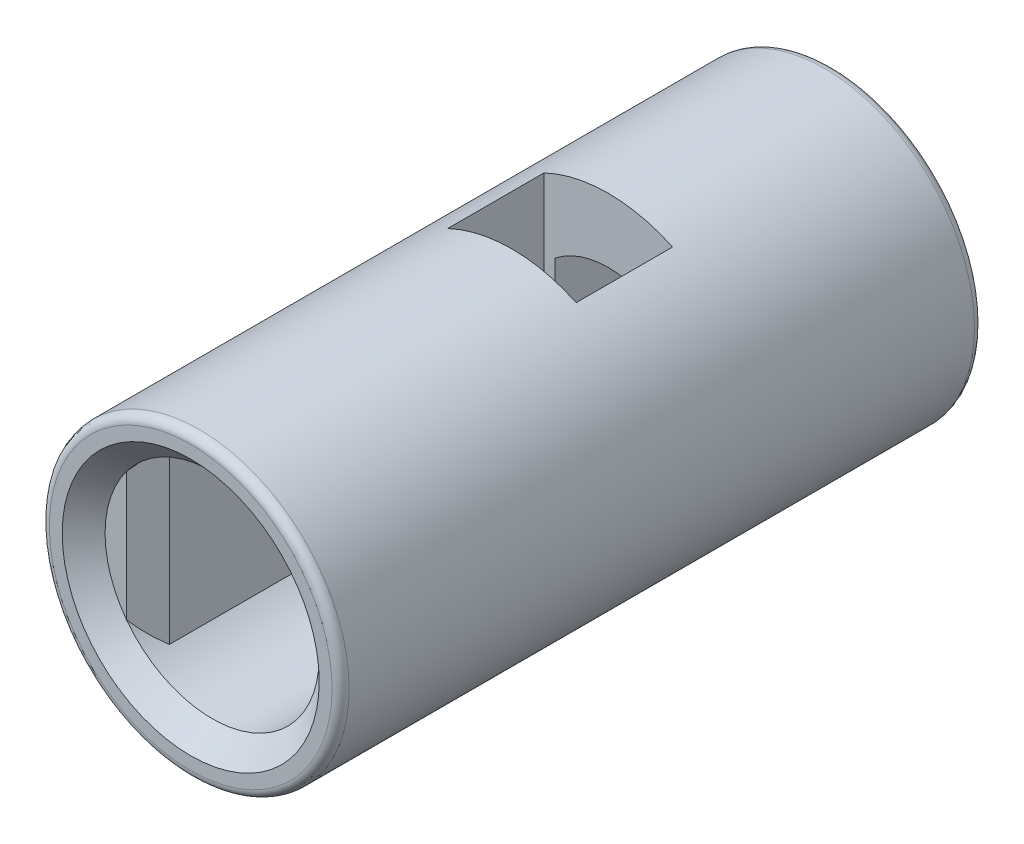
ISO-10303-21;
HEADER;
FILE_DESCRIPTION(('STEP AP214'),'2;1');
FILE_NAME('part.step','',(''),(''),'','','');
FILE_SCHEMA(('AUTOMOTIVE_DESIGN { 1 0 10303 214 1 1 1 1 }'));
ENDSEC;
DATA;
#1=APPLICATION_CONTEXT('core data for automotive mechanical design processes');
#2=APPLICATION_PROTOCOL_DEFINITION('international standard','automotive_design',2000,#1);
#3=PRODUCT_CONTEXT('',#1,'mechanical');
#4=PRODUCT('Part','Part','',(#3));
#5=PRODUCT_RELATED_PRODUCT_CATEGORY('part','',(#4));
#6=PRODUCT_DEFINITION_FORMATION('','',#4);
#7=PRODUCT_DEFINITION_CONTEXT('part definition',#1,'design');
#8=PRODUCT_DEFINITION('design','',#6,#7);
#9=PRODUCT_DEFINITION_SHAPE('','',#8);
#10=(LENGTH_UNIT() NAMED_UNIT(*) SI_UNIT(.MILLI.,.METRE.));
#11=(NAMED_UNIT(*) PLANE_ANGLE_UNIT() SI_UNIT($,.RADIAN.));
#12=(NAMED_UNIT(*) SI_UNIT($,.STERADIAN.) SOLID_ANGLE_UNIT());
#13=UNCERTAINTY_MEASURE_WITH_UNIT(LENGTH_MEASURE(1.E-05),#10,'distance_accuracy_value','');
#14=(GEOMETRIC_REPRESENTATION_CONTEXT(3) GLOBAL_UNCERTAINTY_ASSIGNED_CONTEXT((#13)) GLOBAL_UNIT_ASSIGNED_CONTEXT((#10,
#11,#12)) REPRESENTATION_CONTEXT('',''));
#15=CARTESIAN_POINT('',(0.,0.,0.));
#16=DIRECTION('',(0.,0.,1.));
#17=DIRECTION('',(1.,0.,0.));
#18=AXIS2_PLACEMENT_3D('',#15,#16,#17);
#19=CARTESIAN_POINT('',(0.,3.501,0.));
#20=DIRECTION('',(0.,0.,-1.));
#21=DIRECTION('',(-1.,0.,0.));
#22=AXIS2_PLACEMENT_3D('',#19,#20,#21);
#23=PLANE('',#22);
#24=CARTESIAN_POINT('',(0.,0.,0.));
#25=DIRECTION('',(0.,0.,1.));
#26=DIRECTION('',(1.,0.,0.));
#27=AXIS2_PLACEMENT_3D('',#24,#25,#26);
#28=CIRCLE('',#27,2.5);
#29=CARTESIAN_POINT('',(1.5,2.,0.));
#30=VERTEX_POINT('',#29);
#31=CARTESIAN_POINT('',(-1.5,2.,0.));
#32=VERTEX_POINT('',#31);
#33=EDGE_CURVE('E163',#30,#32,#28,.T.);
#34=ORIENTED_EDGE('',*,*,#33,.T.);
#35=DIRECTION('',(0.,-1.,0.));
#36=VECTOR('',#35,1.);
#37=CARTESIAN_POINT('',(-1.5,3.501,0.));
#38=LINE('',#37,#36);
#39=CARTESIAN_POINT('',(-1.5,3.16227766016838,0.));
#40=VERTEX_POINT('',#39);
#41=EDGE_CURVE('E168',#40,#32,#38,.T.);
#42=ORIENTED_EDGE('',*,*,#41,.F.);
#43=CARTESIAN_POINT('',(0.,0.,0.));
#44=DIRECTION('',(0.,0.,-1.));
#45=DIRECTION('',(-1.,0.,0.));
#46=AXIS2_PLACEMENT_3D('',#43,#44,#45);
#47=CIRCLE('',#46,3.5);
#48=CARTESIAN_POINT('',(1.5,3.16227766016838,0.));
#49=VERTEX_POINT('',#48);
#50=EDGE_CURVE('E284',#49,#40,#47,.F.);
#51=ORIENTED_EDGE('',*,*,#50,.F.);
#52=DIRECTION('',(0.,-1.,0.));
#53=VECTOR('',#52,1.);
#54=CARTESIAN_POINT('',(1.5,3.501,0.));
#55=LINE('',#54,#53);
#56=EDGE_CURVE('E169',#49,#30,#55,.T.);
#57=ORIENTED_EDGE('',*,*,#56,.T.);
#58=EDGE_LOOP('',(#34,#42,#51,#57));
#59=FACE_BOUND('',#58,.T.);
#60=ADVANCED_FACE('F34',(#59),#23,.T.);
#61=CARTESIAN_POINT('',(0.,0.,7.5));
#62=DIRECTION('',(0.,0.,-1.));
#63=DIRECTION('',(-1.,0.,0.));
#64=AXIS2_PLACEMENT_3D('',#61,#62,#63);
#65=CYLINDRICAL_SURFACE('',#64,3.5);
#66=CARTESIAN_POINT('',(0.,0.,-7.3));
#67=DIRECTION('',(0.,0.,1.));
#68=DIRECTION('',(1.,0.,0.));
#69=AXIS2_PLACEMENT_3D('',#66,#67,#68);
#70=CIRCLE('',#69,3.5);
#71=CARTESIAN_POINT('',(3.5,0.,-7.3));
#72=VERTEX_POINT('',#71);
#73=EDGE_CURVE('E195',#72,#72,#70,.T.);
#74=ORIENTED_EDGE('',*,*,#73,.T.);
#75=EDGE_LOOP('',(#74));
#76=FACE_BOUND('',#75,.T.);
#77=CARTESIAN_POINT('',(0.,0.,7.3));
#78=DIRECTION('',(0.,0.,1.));
#79=DIRECTION('',(1.,0.,0.));
#80=AXIS2_PLACEMENT_3D('',#77,#78,#79);
#81=CIRCLE('',#80,3.5);
#82=CARTESIAN_POINT('',(3.5,0.,7.3));
#83=VERTEX_POINT('',#82);
#84=EDGE_CURVE('E192',#83,#83,#81,.F.);
#85=ORIENTED_EDGE('',*,*,#84,.T.);
#86=EDGE_LOOP('',(#85));
#87=FACE_BOUND('',#86,.T.);
#88=DIRECTION('',(0.,0.,-1.));
#89=VECTOR('',#88,1.);
#90=CARTESIAN_POINT('',(-1.5,-3.16227766016838,7.5));
#91=LINE('',#90,#89);
#92=CARTESIAN_POINT('',(-1.5,-3.16227766016838,0.));
#93=VERTEX_POINT('',#92);
#94=CARTESIAN_POINT('',(-1.5,-3.16227766016838,-2.25));
#95=VERTEX_POINT('',#94);
#96=EDGE_CURVE('E315',#93,#95,#91,.T.);
#97=ORIENTED_EDGE('',*,*,#96,.F.);
#98=CARTESIAN_POINT('',(0.,0.,0.));
#99=DIRECTION('',(0.,0.,1.));
#100=DIRECTION('',(1.,0.,0.));
#101=AXIS2_PLACEMENT_3D('',#98,#99,#100);
#102=CIRCLE('',#101,3.5);
#103=CARTESIAN_POINT('',(1.5,-3.16227766016838,0.));
#104=VERTEX_POINT('',#103);
#105=EDGE_CURVE('E166',#104,#93,#102,.F.);
#106=ORIENTED_EDGE('',*,*,#105,.F.);
#107=DIRECTION('',(0.,0.,-1.));
#108=VECTOR('',#107,1.);
#109=CARTESIAN_POINT('',(1.5,-3.16227766016838,7.5));
#110=LINE('',#109,#108);
#111=CARTESIAN_POINT('',(1.5,-3.16227766016838,-2.25));
#112=VERTEX_POINT('',#111);
#113=EDGE_CURVE('E319',#112,#104,#110,.F.);
#114=ORIENTED_EDGE('',*,*,#113,.F.);
#115=CARTESIAN_POINT('',(0.,0.,-2.25));
#116=DIRECTION('',(0.,0.,-1.));
#117=DIRECTION('',(-1.,0.,0.));
#118=AXIS2_PLACEMENT_3D('',#115,#116,#117);
#119=CIRCLE('',#118,3.5);
#120=EDGE_CURVE('E317',#95,#112,#119,.F.);
#121=ORIENTED_EDGE('',*,*,#120,.F.);
#122=EDGE_LOOP('',(#97,#106,#114,#121));
#123=FACE_BOUND('',#122,.T.);
#124=DIRECTION('',(0.,0.,-1.));
#125=VECTOR('',#124,1.);
#126=CARTESIAN_POINT('',(-1.5,3.16227766016838,7.5));
#127=LINE('',#126,#125);
#128=CARTESIAN_POINT('',(-1.5,3.16227766016838,-2.25));
#129=VERTEX_POINT('',#128);
#130=EDGE_CURVE('E291',#40,#129,#127,.T.);
#131=ORIENTED_EDGE('',*,*,#130,.T.);
#132=CARTESIAN_POINT('',(0.,0.,-2.25));
#133=DIRECTION('',(0.,0.,1.));
#134=DIRECTION('',(1.,0.,0.));
#135=AXIS2_PLACEMENT_3D('',#132,#133,#134);
#136=CIRCLE('',#135,3.5);
#137=CARTESIAN_POINT('',(1.5,3.16227766016838,-2.25));
#138=VERTEX_POINT('',#137);
#139=EDGE_CURVE('E180',#129,#138,#136,.F.);
#140=ORIENTED_EDGE('',*,*,#139,.T.);
#141=DIRECTION('',(0.,0.,-1.));
#142=VECTOR('',#141,1.);
#143=CARTESIAN_POINT('',(1.5,3.16227766016838,7.5));
#144=LINE('',#143,#142);
#145=EDGE_CURVE('E280',#138,#49,#144,.F.);
#146=ORIENTED_EDGE('',*,*,#145,.T.);
#147=ORIENTED_EDGE('',*,*,#50,.T.);
#148=EDGE_LOOP('',(#131,#140,#146,#147));
#149=FACE_BOUND('',#148,.T.);
#150=ADVANCED_FACE('F310',(#76,#87,#123,#149),#65,.T.);
#151=CARTESIAN_POINT('',(0.,0.,7.5));
#152=DIRECTION('',(0.,0.,-1.));
#153=DIRECTION('',(-1.,0.,0.));
#154=AXIS2_PLACEMENT_3D('',#151,#152,#153);
#155=CYLINDRICAL_SURFACE('',#154,2.);
#156=DIRECTION('',(0.,0.,-1.));
#157=VECTOR('',#156,1.);
#158=CARTESIAN_POINT('',(1.25,-1.5612494995996,7.5));
#159=LINE('',#158,#157);
#160=CARTESIAN_POINT('',(1.25,-1.5612494995996,-2.25));
#161=VERTEX_POINT('',#160);
#162=CARTESIAN_POINT('',(1.25,-1.5612494995996,-7.));
#163=VERTEX_POINT('',#162);
#164=EDGE_CURVE('E190',#161,#163,#159,.T.);
#165=ORIENTED_EDGE('',*,*,#164,.T.);
#166=CARTESIAN_POINT('',(0.,0.,-7.));
#167=DIRECTION('',(0.,0.,1.));
#168=DIRECTION('',(1.,0.,0.));
#169=AXIS2_PLACEMENT_3D('',#166,#167,#168);
#170=CIRCLE('',#169,2.);
#171=CARTESIAN_POINT('',(-1.25,-1.5612494995996,-7.));
#172=VERTEX_POINT('',#171);
#173=EDGE_CURVE('E47',#163,#172,#170,.F.);
#174=ORIENTED_EDGE('',*,*,#173,.T.);
#175=DIRECTION('',(0.,0.,-1.));
#176=VECTOR('',#175,1.);
#177=CARTESIAN_POINT('',(-1.25,-1.5612494995996,7.5));
#178=LINE('',#177,#176);
#179=CARTESIAN_POINT('',(-1.25,-1.5612494995996,-2.25));
#180=VERTEX_POINT('',#179);
#181=EDGE_CURVE('E183',#180,#172,#178,.T.);
#182=ORIENTED_EDGE('',*,*,#181,.F.);
#183=CARTESIAN_POINT('',(0.,0.,-2.25));
#184=DIRECTION('',(0.,0.,-1.));
#185=DIRECTION('',(-1.,0.,0.));
#186=AXIS2_PLACEMENT_3D('',#183,#184,#185);
#187=CIRCLE('',#186,2.);
#188=EDGE_CURVE('E323',#180,#161,#187,.F.);
#189=ORIENTED_EDGE('',*,*,#188,.T.);
#190=EDGE_LOOP('',(#165,#174,#182,#189));
#191=FACE_BOUND('',#190,.T.);
#192=ADVANCED_FACE('F352',(#191),#155,.F.);
#193=CARTESIAN_POINT('',(1.25,1.5612494995996,7.5));
#194=DIRECTION('',(-1.,0.,0.));
#195=DIRECTION('',(0.,-1.,0.));
#196=AXIS2_PLACEMENT_3D('',#193,#194,#195);
#197=PLANE('',#196);
#198=DIRECTION('',(0.,0.,-1.));
#199=VECTOR('',#198,1.);
#200=CARTESIAN_POINT('',(1.25,1.5612494995996,7.5));
#201=LINE('',#200,#199);
#202=CARTESIAN_POINT('',(1.25,1.5612494995996,-2.25));
#203=VERTEX_POINT('',#202);
#204=CARTESIAN_POINT('',(1.25,1.5612494995996,-7.));
#205=VERTEX_POINT('',#204);
#206=EDGE_CURVE('E188',#203,#205,#201,.T.);
#207=ORIENTED_EDGE('',*,*,#206,.T.);
#208=DIRECTION('',(0.,-1.,0.));
#209=VECTOR('',#208,1.);
#210=CARTESIAN_POINT('',(1.25,-1.5612494995996,-7.));
#211=LINE('',#210,#209);
#212=EDGE_CURVE('E11',#205,#163,#211,.T.);
#213=ORIENTED_EDGE('',*,*,#212,.T.);
#214=ORIENTED_EDGE('',*,*,#164,.F.);
#215=DIRECTION('',(0.,-1.,0.));
#216=VECTOR('',#215,1.);
#217=CARTESIAN_POINT('',(1.25,3.501,-2.25));
#218=LINE('',#217,#216);
#219=EDGE_CURVE('E277',#203,#161,#218,.T.);
#220=ORIENTED_EDGE('',*,*,#219,.F.);
#221=EDGE_LOOP('',(#207,#213,#214,#220));
#222=FACE_BOUND('',#221,.T.);
#223=ADVANCED_FACE('F276',(#222),#197,.T.);
#224=CARTESIAN_POINT('',(0.,0.,7.5));
#225=DIRECTION('',(0.,0.,-1.));
#226=DIRECTION('',(-1.,0.,0.));
#227=AXIS2_PLACEMENT_3D('',#224,#225,#226);
#228=CYLINDRICAL_SURFACE('',#227,2.);
#229=DIRECTION('',(0.,0.,-1.));
#230=VECTOR('',#229,1.);
#231=CARTESIAN_POINT('',(-1.25,1.5612494995996,7.5));
#232=LINE('',#231,#230);
#233=CARTESIAN_POINT('',(-1.25,1.5612494995996,-2.25));
#234=VERTEX_POINT('',#233);
#235=CARTESIAN_POINT('',(-1.25,1.5612494995996,-7.));
#236=VERTEX_POINT('',#235);
#237=EDGE_CURVE('E185',#234,#236,#232,.T.);
#238=ORIENTED_EDGE('',*,*,#237,.T.);
#239=CARTESIAN_POINT('',(0.,0.,-7.));
#240=DIRECTION('',(0.,0.,1.));
#241=DIRECTION('',(1.,0.,0.));
#242=AXIS2_PLACEMENT_3D('',#239,#240,#241);
#243=CIRCLE('',#242,2.);
#244=EDGE_CURVE('E226',#236,#205,#243,.F.);
#245=ORIENTED_EDGE('',*,*,#244,.T.);
#246=ORIENTED_EDGE('',*,*,#206,.F.);
#247=CARTESIAN_POINT('',(0.,0.,-2.25));
#248=DIRECTION('',(0.,0.,1.));
#249=DIRECTION('',(1.,0.,0.));
#250=AXIS2_PLACEMENT_3D('',#247,#248,#249);
#251=CIRCLE('',#250,2.);
#252=EDGE_CURVE('E172',#234,#203,#251,.F.);
#253=ORIENTED_EDGE('',*,*,#252,.F.);
#254=EDGE_LOOP('',(#238,#245,#246,#253));
#255=FACE_BOUND('',#254,.T.);
#256=ADVANCED_FACE('F272',(#255),#228,.F.);
#257=CARTESIAN_POINT('',(-1.25,1.5612494995996,7.5));
#258=DIRECTION('',(1.,0.,0.));
#259=DIRECTION('',(0.,1.,0.));
#260=AXIS2_PLACEMENT_3D('',#257,#258,#259);
#261=PLANE('',#260);
#262=ORIENTED_EDGE('',*,*,#181,.T.);
#263=DIRECTION('',(0.,1.,0.));
#264=VECTOR('',#263,1.);
#265=CARTESIAN_POINT('',(-1.25,1.5612494995996,-7.));
#266=LINE('',#265,#264);
#267=EDGE_CURVE('E229',#172,#236,#266,.T.);
#268=ORIENTED_EDGE('',*,*,#267,.T.);
#269=ORIENTED_EDGE('',*,*,#237,.F.);
#270=DIRECTION('',(0.,1.,0.));
#271=VECTOR('',#270,1.);
#272=CARTESIAN_POINT('',(-1.25,3.501,-2.25));
#273=LINE('',#272,#271);
#274=EDGE_CURVE('E281',#180,#234,#273,.T.);
#275=ORIENTED_EDGE('',*,*,#274,.F.);
#276=EDGE_LOOP('',(#262,#268,#269,#275));
#277=FACE_BOUND('',#276,.T.);
#278=ADVANCED_FACE('F370',(#277),#261,.T.);
#279=CARTESIAN_POINT('',(0.,0.,7.5));
#280=DIRECTION('',(0.,0.,1.));
#281=DIRECTION('',(1.,0.,0.));
#282=AXIS2_PLACEMENT_3D('',#279,#280,#281);
#283=PLANE('',#282);
#284=CARTESIAN_POINT('',(0.,0.,7.5));
#285=DIRECTION('',(0.,0.,1.));
#286=DIRECTION('',(1.,0.,0.));
#287=AXIS2_PLACEMENT_3D('',#284,#285,#286);
#288=CIRCLE('',#287,3.00000000000001);
#289=CARTESIAN_POINT('',(3.00000000000001,0.,7.5));
#290=VERTEX_POINT('',#289);
#291=EDGE_CURVE('E204',#290,#290,#288,.F.);
#292=ORIENTED_EDGE('',*,*,#291,.T.);
#293=EDGE_LOOP('',(#292));
#294=FACE_BOUND('',#293,.T.);
#295=CARTESIAN_POINT('',(0.,0.,7.5));
#296=DIRECTION('',(0.,0.,1.));
#297=DIRECTION('',(1.,0.,0.));
#298=AXIS2_PLACEMENT_3D('',#295,#296,#297);
#299=CIRCLE('',#298,3.3);
#300=CARTESIAN_POINT('',(3.3,0.,7.5));
#301=VERTEX_POINT('',#300);
#302=EDGE_CURVE('E201',#301,#301,#299,.T.);
#303=ORIENTED_EDGE('',*,*,#302,.T.);
#304=EDGE_LOOP('',(#303));
#305=FACE_BOUND('',#304,.T.);
#306=ADVANCED_FACE('F366',(#294,#305),#283,.T.);
#307=CARTESIAN_POINT('',(0.,0.,-7.5));
#308=DIRECTION('',(0.,0.,1.));
#309=DIRECTION('',(1.,0.,0.));
#310=AXIS2_PLACEMENT_3D('',#307,#308,#309);
#311=PLANE('',#310);
#312=DIRECTION('',(0.,1.,0.));
#313=VECTOR('',#312,1.);
#314=CARTESIAN_POINT('',(1.75,1.5612494995996,-7.5));
#315=LINE('',#314,#313);
#316=CARTESIAN_POINT('',(1.75,-1.78535710713571,-7.5));
#317=VERTEX_POINT('',#316);
#318=CARTESIAN_POINT('',(1.75,1.78535710713571,-7.5));
#319=VERTEX_POINT('',#318);
#320=EDGE_CURVE('E217',#317,#319,#315,.T.);
#321=ORIENTED_EDGE('',*,*,#320,.T.);
#322=CARTESIAN_POINT('',(0.,0.,-7.5));
#323=DIRECTION('',(0.,0.,1.));
#324=DIRECTION('',(1.,0.,0.));
#325=AXIS2_PLACEMENT_3D('',#322,#323,#324);
#326=CIRCLE('',#325,2.5);
#327=CARTESIAN_POINT('',(-1.75,1.78535710713571,-7.5));
#328=VERTEX_POINT('',#327);
#329=EDGE_CURVE('E223',#319,#328,#326,.T.);
#330=ORIENTED_EDGE('',*,*,#329,.T.);
#331=DIRECTION('',(0.,-1.,0.));
#332=VECTOR('',#331,1.);
#333=CARTESIAN_POINT('',(-1.75,-1.5612494995996,-7.5));
#334=LINE('',#333,#332);
#335=CARTESIAN_POINT('',(-1.75,-1.78535710713571,-7.5));
#336=VERTEX_POINT('',#335);
#337=EDGE_CURVE('E221',#328,#336,#334,.T.);
#338=ORIENTED_EDGE('',*,*,#337,.T.);
#339=CARTESIAN_POINT('',(0.,0.,-7.5));
#340=DIRECTION('',(0.,0.,1.));
#341=DIRECTION('',(1.,0.,0.));
#342=AXIS2_PLACEMENT_3D('',#339,#340,#341);
#343=CIRCLE('',#342,2.5);
#344=EDGE_CURVE('E219',#336,#317,#343,.T.);
#345=ORIENTED_EDGE('',*,*,#344,.T.);
#346=EDGE_LOOP('',(#321,#330,#338,#345));
#347=FACE_BOUND('',#346,.T.);
#348=CARTESIAN_POINT('',(0.,0.,-7.5));
#349=DIRECTION('',(0.,0.,1.));
#350=DIRECTION('',(1.,0.,0.));
#351=AXIS2_PLACEMENT_3D('',#348,#349,#350);
#352=CIRCLE('',#351,3.3);
#353=CARTESIAN_POINT('',(3.3,0.,-7.5));
#354=VERTEX_POINT('',#353);
#355=EDGE_CURVE('E198',#354,#354,#352,.F.);
#356=ORIENTED_EDGE('',*,*,#355,.T.);
#357=EDGE_LOOP('',(#356));
#358=FACE_BOUND('',#357,.T.);
#359=ADVANCED_FACE('F362',(#347,#358),#311,.F.);
#360=CARTESIAN_POINT('',(-1.5,3.501,-2.25));
#361=DIRECTION('',(1.,0.,0.));
#362=DIRECTION('',(0.,0.,-1.));
#363=AXIS2_PLACEMENT_3D('',#360,#361,#362);
#364=PLANE('',#363);
#365=DIRECTION('',(0.,0.,1.));
#366=VECTOR('',#365,1.);
#367=CARTESIAN_POINT('',(-1.5,2.,0.));
#368=LINE('',#367,#366);
#369=CARTESIAN_POINT('',(-1.5,2.,6.5));
#370=VERTEX_POINT('',#369);
#371=EDGE_CURVE('E152',#32,#370,#368,.T.);
#372=ORIENTED_EDGE('',*,*,#371,.T.);
#373=DIRECTION('',(0.,-1.,0.));
#374=VECTOR('',#373,1.);
#375=CARTESIAN_POINT('',(-1.5,3.501,6.5));
#376=LINE('',#375,#374);
#377=CARTESIAN_POINT('',(-1.5,-2.,6.5));
#378=VERTEX_POINT('',#377);
#379=EDGE_CURVE('E149',#370,#378,#376,.T.);
#380=ORIENTED_EDGE('',*,*,#379,.T.);
#381=DIRECTION('',(0.,0.,1.));
#382=VECTOR('',#381,1.);
#383=CARTESIAN_POINT('',(-1.5,-2.,0.));
#384=LINE('',#383,#382);
#385=CARTESIAN_POINT('',(-1.5,-2.,0.));
#386=VERTEX_POINT('',#385);
#387=EDGE_CURVE('E141',#386,#378,#384,.T.);
#388=ORIENTED_EDGE('',*,*,#387,.F.);
#389=EDGE_CURVE('E146',#386,#93,#38,.T.);
#390=ORIENTED_EDGE('',*,*,#389,.T.);
#391=ORIENTED_EDGE('',*,*,#96,.T.);
#392=DIRECTION('',(0.,-1.,0.));
#393=VECTOR('',#392,1.);
#394=CARTESIAN_POINT('',(-1.5,3.501,-2.25));
#395=LINE('',#394,#393);
#396=EDGE_CURVE('E294',#129,#95,#395,.T.);
#397=ORIENTED_EDGE('',*,*,#396,.F.);
#398=ORIENTED_EDGE('',*,*,#130,.F.);
#399=ORIENTED_EDGE('',*,*,#41,.T.);
#400=EDGE_LOOP('',(#372,#380,#388,#390,#391,#397,#398,#399));
#401=FACE_BOUND('',#400,.T.);
#402=ADVANCED_FACE('F144',(#401),#364,.T.);
#403=CARTESIAN_POINT('',(1.5,-2.,0.));
#404=VERTEX_POINT('',#403);
#405=EDGE_CURVE('E153',#386,#404,#28,.T.);
#406=ORIENTED_EDGE('',*,*,#405,.T.);
#407=EDGE_CURVE('E176',#404,#104,#55,.T.);
#408=ORIENTED_EDGE('',*,*,#407,.T.);
#409=ORIENTED_EDGE('',*,*,#105,.T.);
#410=ORIENTED_EDGE('',*,*,#389,.F.);
#411=EDGE_LOOP('',(#406,#408,#409,#410));
#412=FACE_BOUND('',#411,.T.);
#413=ADVANCED_FACE('F164',(#412),#23,.T.);
#414=CARTESIAN_POINT('',(1.5,3.501,-2.25));
#415=DIRECTION('',(-1.,0.,0.));
#416=DIRECTION('',(0.,0.,1.));
#417=AXIS2_PLACEMENT_3D('',#414,#415,#416);
#418=PLANE('',#417);
#419=DIRECTION('',(0.,-1.,0.));
#420=VECTOR('',#419,1.);
#421=CARTESIAN_POINT('',(1.5,3.501,-2.25));
#422=LINE('',#421,#420);
#423=EDGE_CURVE('E296',#138,#112,#422,.T.);
#424=ORIENTED_EDGE('',*,*,#423,.T.);
#425=ORIENTED_EDGE('',*,*,#113,.T.);
#426=ORIENTED_EDGE('',*,*,#407,.F.);
#427=EDGE_CURVE('E174',#30,#404,#55,.T.);
#428=ORIENTED_EDGE('',*,*,#427,.F.);
#429=ORIENTED_EDGE('',*,*,#56,.F.);
#430=ORIENTED_EDGE('',*,*,#145,.F.);
#431=EDGE_LOOP('',(#424,#425,#426,#428,#429,#430));
#432=FACE_BOUND('',#431,.T.);
#433=ADVANCED_FACE('F305',(#432),#418,.T.);
#434=CARTESIAN_POINT('',(-1.5,3.501,-2.25));
#435=DIRECTION('',(0.,0.,1.));
#436=DIRECTION('',(1.,0.,0.));
#437=AXIS2_PLACEMENT_3D('',#434,#435,#436);
#438=PLANE('',#437);
#439=ORIENTED_EDGE('',*,*,#188,.F.);
#440=ORIENTED_EDGE('',*,*,#274,.T.);
#441=ORIENTED_EDGE('',*,*,#252,.T.);
#442=ORIENTED_EDGE('',*,*,#219,.T.);
#443=EDGE_LOOP('',(#439,#440,#441,#442));
#444=FACE_BOUND('',#443,.T.);
#445=ORIENTED_EDGE('',*,*,#396,.T.);
#446=ORIENTED_EDGE('',*,*,#120,.T.);
#447=ORIENTED_EDGE('',*,*,#423,.F.);
#448=ORIENTED_EDGE('',*,*,#139,.F.);
#449=EDGE_LOOP('',(#445,#446,#447,#448));
#450=FACE_BOUND('',#449,.T.);
#451=ADVANCED_FACE('F313',(#444,#450),#438,.T.);
#452=CARTESIAN_POINT('',(0.,0.,-7.3));
#453=DIRECTION('',(0.,0.,1.));
#454=DIRECTION('',(1.,0.,0.));
#455=AXIS2_PLACEMENT_3D('',#452,#453,#454);
#456=TOROIDAL_SURFACE('',#455,3.3,0.2);
#457=ORIENTED_EDGE('',*,*,#355,.F.);
#458=EDGE_LOOP('',(#457));
#459=FACE_BOUND('',#458,.T.);
#460=ORIENTED_EDGE('',*,*,#73,.F.);
#461=EDGE_LOOP('',(#460));
#462=FACE_BOUND('',#461,.T.);
#463=ADVANCED_FACE('F383',(#459,#462),#456,.T.);
#464=CARTESIAN_POINT('',(0.,0.,7.3));
#465=DIRECTION('',(0.,0.,1.));
#466=DIRECTION('',(1.,0.,0.));
#467=AXIS2_PLACEMENT_3D('',#464,#465,#466);
#468=TOROIDAL_SURFACE('',#467,3.3,0.2);
#469=ORIENTED_EDGE('',*,*,#84,.F.);
#470=EDGE_LOOP('',(#469));
#471=FACE_BOUND('',#470,.T.);
#472=ORIENTED_EDGE('',*,*,#302,.F.);
#473=EDGE_LOOP('',(#472));
#474=FACE_BOUND('',#473,.T.);
#475=ADVANCED_FACE('F385',(#471,#474),#468,.T.);
#476=CARTESIAN_POINT('',(0.,0.,7.));
#477=DIRECTION('',(0.,0.,1.));
#478=DIRECTION('',(1.,0.,0.));
#479=AXIS2_PLACEMENT_3D('',#476,#477,#478);
#480=CYLINDRICAL_SURFACE('',#479,2.5);
#481=CARTESIAN_POINT('',(0.,0.,5.));
#482=DIRECTION('',(-0.707106781186547,0.,-0.707106781186548));
#483=DIRECTION('',(-0.707106781186548,0.,0.707106781186547));
#484=AXIS2_PLACEMENT_3D('',#481,#482,#483);
#485=ELLIPSE('',#484,3.53553390593273,2.5);
#486=CARTESIAN_POINT('',(-2.,-1.5,7.));
#487=VERTEX_POINT('',#486);
#488=EDGE_CURVE('E211',#378,#487,#485,.T.);
#489=ORIENTED_EDGE('',*,*,#488,.T.);
#490=CARTESIAN_POINT('',(0.,0.,6.99999999999999));
#491=DIRECTION('',(0.,0.,1.));
#492=DIRECTION('',(1.,0.,0.));
#493=AXIS2_PLACEMENT_3D('',#490,#491,#492);
#494=CIRCLE('',#493,2.5);
#495=CARTESIAN_POINT('',(-2.,1.5,7.));
#496=VERTEX_POINT('',#495);
#497=EDGE_CURVE('E215',#487,#496,#494,.T.);
#498=ORIENTED_EDGE('',*,*,#497,.T.);
#499=CARTESIAN_POINT('',(0.,0.,5.));
#500=DIRECTION('',(-0.707106781186547,0.,-0.707106781186548));
#501=DIRECTION('',(-0.707106781186548,0.,0.707106781186547));
#502=AXIS2_PLACEMENT_3D('',#499,#500,#501);
#503=ELLIPSE('',#502,3.53553390593273,2.5);
#504=EDGE_CURVE('E213',#496,#370,#503,.T.);
#505=ORIENTED_EDGE('',*,*,#504,.T.);
#506=ORIENTED_EDGE('',*,*,#371,.F.);
#507=ORIENTED_EDGE('',*,*,#33,.F.);
#508=EDGE_CURVE('E159',#404,#30,#28,.T.);
#509=ORIENTED_EDGE('',*,*,#508,.F.);
#510=ORIENTED_EDGE('',*,*,#405,.F.);
#511=ORIENTED_EDGE('',*,*,#387,.T.);
#512=EDGE_LOOP('',(#489,#498,#505,#506,#507,#509,#510,#511));
#513=FACE_BOUND('',#512,.T.);
#514=ADVANCED_FACE('F157',(#513),#480,.F.);
#515=CARTESIAN_POINT('',(0.,0.,7.));
#516=DIRECTION('',(0.,0.,1.));
#517=DIRECTION('',(1.,0.,0.));
#518=AXIS2_PLACEMENT_3D('',#515,#516,#517);
#519=PLANE('',#518);
#520=CARTESIAN_POINT('',(0.,0.,7.));
#521=DIRECTION('',(0.,0.,1.));
#522=DIRECTION('',(1.,0.,0.));
#523=AXIS2_PLACEMENT_3D('',#520,#521,#522);
#524=CIRCLE('',#523,2.5);
#525=EDGE_CURVE('E325',#496,#487,#524,.T.);
#526=ORIENTED_EDGE('',*,*,#525,.T.);
#527=DIRECTION('',(0.,1.,0.));
#528=VECTOR('',#527,1.);
#529=CARTESIAN_POINT('',(-2.,0.,7.));
#530=LINE('',#529,#528);
#531=EDGE_CURVE('E208',#487,#496,#530,.T.);
#532=ORIENTED_EDGE('',*,*,#531,.T.);
#533=EDGE_LOOP('',(#526,#532));
#534=FACE_BOUND('',#533,.T.);
#535=ADVANCED_FACE('F334',(#534),#519,.T.);
#536=CARTESIAN_POINT('',(0.,0.,0.));
#537=DIRECTION('',(0.,0.,1.));
#538=DIRECTION('',(1.,0.,0.));
#539=AXIS2_PLACEMENT_3D('',#536,#537,#538);
#540=PLANE('',#539);
#541=ORIENTED_EDGE('',*,*,#508,.T.);
#542=ORIENTED_EDGE('',*,*,#427,.T.);
#543=EDGE_LOOP('',(#541,#542));
#544=FACE_BOUND('',#543,.T.);
#545=ADVANCED_FACE('F303',(#544),#540,.T.);
#546=CARTESIAN_POINT('',(0.,0.,6.99999999999999));
#547=DIRECTION('',(0.,0.,1.));
#548=DIRECTION('',(1.,0.,0.));
#549=AXIS2_PLACEMENT_3D('',#546,#547,#548);
#550=CONICAL_SURFACE('',#549,2.5,0.785398163397449);
#551=ORIENTED_EDGE('',*,*,#291,.F.);
#552=EDGE_LOOP('',(#551));
#553=FACE_BOUND('',#552,.T.);
#554=ORIENTED_EDGE('',*,*,#497,.F.);
#555=ORIENTED_EDGE('',*,*,#525,.F.);
#556=EDGE_LOOP('',(#554,#555));
#557=FACE_BOUND('',#556,.T.);
#558=ADVANCED_FACE('F336',(#553,#557),#550,.F.);
#559=CARTESIAN_POINT('',(-1.5,3.501,6.5));
#560=DIRECTION('',(-0.707106781186547,0.,-0.707106781186548));
#561=DIRECTION('',(0.,-1.,0.));
#562=AXIS2_PLACEMENT_3D('',#559,#560,#561);
#563=PLANE('',#562);
#564=ORIENTED_EDGE('',*,*,#504,.F.);
#565=ORIENTED_EDGE('',*,*,#531,.F.);
#566=ORIENTED_EDGE('',*,*,#488,.F.);
#567=ORIENTED_EDGE('',*,*,#379,.F.);
#568=EDGE_LOOP('',(#564,#565,#566,#567));
#569=FACE_BOUND('',#568,.T.);
#570=ADVANCED_FACE('F330',(#569),#563,.F.);
#571=CARTESIAN_POINT('',(0.,0.,-7.5));
#572=DIRECTION('',(0.,0.,-1.));
#573=DIRECTION('',(-1.,0.,0.));
#574=AXIS2_PLACEMENT_3D('',#571,#572,#573);
#575=CONICAL_SURFACE('',#574,2.5,0.785398163397447);
#576=CARTESIAN_POINT('',(-1.75,-1.78535710713571,-7.5));
#577=CARTESIAN_POINT('',(-1.70809654208577,-1.76775305588156,-7.45809654208577));
#578=CARTESIAN_POINT('',(-1.66624264284415,-1.74991162458492,-7.41624264284415));
#579=CARTESIAN_POINT('',(-1.58265125575847,-1.71371100376041,-7.33265125575847));
#580=CARTESIAN_POINT('',(-1.54091375746074,-1.69535186248754,-7.29091375746074));
#581=CARTESIAN_POINT('',(-1.45756363840239,-1.65806910536192,-7.20756363840238));
#582=CARTESIAN_POINT('',(-1.41595102077517,-1.63914547547371,-7.16595102077516));
#583=CARTESIAN_POINT('',(-1.3328654118153,-1.6006769448218,-7.0828654118153));
#584=CARTESIAN_POINT('',(-1.29139243382501,-1.58113198645534,-7.041392433825));
#585=CARTESIAN_POINT('',(-1.25,-1.5612494995996,-7.));
#586=B_SPLINE_CURVE_WITH_KNOTS('',3,(#576,#577,#578,#579,#580,#581,#582,#583,#584,#585),
.UNSPECIFIED.,.F.,.F.,(4,2,2,2,4),(0.,0.185459845107802,0.370902460541153,0.556349690676135,
0.741814163876251),.UNSPECIFIED.);
#587=EDGE_CURVE('E253',#172,#336,#586,.F.);
#588=ORIENTED_EDGE('',*,*,#587,.F.);
#589=ORIENTED_EDGE('',*,*,#173,.F.);
#590=CARTESIAN_POINT('',(1.75,-1.78535710713571,-7.5));
#591=CARTESIAN_POINT('',(1.70809654208578,-1.76775305588156,-7.45809654208577));
#592=CARTESIAN_POINT('',(1.66624264284416,-1.74991162458492,-7.41624264284415));
#593=CARTESIAN_POINT('',(1.58265125575847,-1.71371100376041,-7.33265125575847));
#594=CARTESIAN_POINT('',(1.54091375746074,-1.69535186248754,-7.29091375746074));
#595=CARTESIAN_POINT('',(1.45756363840239,-1.65806910536192,-7.20756363840238));
#596=CARTESIAN_POINT('',(1.41595102077517,-1.63914547547371,-7.16595102077516));
#597=CARTESIAN_POINT('',(1.3328654118153,-1.6006769448218,-7.0828654118153));
#598=CARTESIAN_POINT('',(1.29139243382501,-1.58113198645534,-7.041392433825));
#599=CARTESIAN_POINT('',(1.25,-1.5612494995996,-7.));
#600=B_SPLINE_CURVE_WITH_KNOTS('',3,(#590,#591,#592,#593,#594,#595,#596,#597,#598,#599),
.UNSPECIFIED.,.F.,.F.,(4,2,2,2,4),(0.,0.185459845107802,0.370902460541153,0.556349690676135,
0.741814163876251),.UNSPECIFIED.);
#601=EDGE_CURVE('E39',#317,#163,#600,.T.);
#602=ORIENTED_EDGE('',*,*,#601,.F.);
#603=ORIENTED_EDGE('',*,*,#344,.F.);
#604=EDGE_LOOP('',(#588,#589,#602,#603));
#605=FACE_BOUND('',#604,.T.);
#606=ADVANCED_FACE('F36',(#605),#575,.F.);
#607=CARTESIAN_POINT('',(1.75,0.,-7.5));
#608=DIRECTION('',(-0.707106781186549,0.,-0.707106781186546));
#609=DIRECTION('',(0.,-1.,0.));
#610=AXIS2_PLACEMENT_3D('',#607,#608,#609);
#611=PLANE('',#610);
#612=ORIENTED_EDGE('',*,*,#601,.T.);
#613=ORIENTED_EDGE('',*,*,#212,.F.);
#614=CARTESIAN_POINT('',(1.25,1.5612494995996,-7.));
#615=CARTESIAN_POINT('',(1.29139243382501,1.58113198645534,-7.041392433825));
#616=CARTESIAN_POINT('',(1.3328654118153,1.6006769448218,-7.0828654118153));
#617=CARTESIAN_POINT('',(1.41595102077517,1.63914547547371,-7.16595102077516));
#618=CARTESIAN_POINT('',(1.45756363840239,1.65806910536192,-7.20756363840238));
#619=CARTESIAN_POINT('',(1.54091375746074,1.69535186248754,-7.29091375746074));
#620=CARTESIAN_POINT('',(1.58265125575847,1.71371100376041,-7.33265125575847));
#621=CARTESIAN_POINT('',(1.66624264284416,1.74991162458492,-7.41624264284415));
#622=CARTESIAN_POINT('',(1.70809654208577,1.76775305588156,-7.45809654208577));
#623=CARTESIAN_POINT('',(1.75,1.78535710713571,-7.5));
#624=B_SPLINE_CURVE_WITH_KNOTS('',3,(#614,#615,#616,#617,#618,#619,#620,#621,#622,#623),
.UNSPECIFIED.,.F.,.F.,(4,2,2,2,4),(0.,0.185464473200115,0.370911703335099,0.55635431876845,
0.741814163876252),.UNSPECIFIED.);
#625=EDGE_CURVE('E239',#319,#205,#624,.F.);
#626=ORIENTED_EDGE('',*,*,#625,.F.);
#627=ORIENTED_EDGE('',*,*,#320,.F.);
#628=EDGE_LOOP('',(#612,#613,#626,#627));
#629=FACE_BOUND('',#628,.T.);
#630=ADVANCED_FACE('F249',(#629),#611,.T.);
#631=CARTESIAN_POINT('',(-1.75,0.,-7.5));
#632=DIRECTION('',(0.707106781186549,0.,-0.707106781186546));
#633=DIRECTION('',(0.,1.,0.));
#634=AXIS2_PLACEMENT_3D('',#631,#632,#633);
#635=PLANE('',#634);
#636=ORIENTED_EDGE('',*,*,#587,.T.);
#637=ORIENTED_EDGE('',*,*,#337,.F.);
#638=CARTESIAN_POINT('',(-1.75,1.78535710713571,-7.5));
#639=CARTESIAN_POINT('',(-1.70809654208577,1.76775305588156,-7.45809654208577));
#640=CARTESIAN_POINT('',(-1.66624264284416,1.74991162458492,-7.41624264284415));
#641=CARTESIAN_POINT('',(-1.58265125575847,1.71371100376041,-7.33265125575847));
#642=CARTESIAN_POINT('',(-1.54091375746074,1.69535186248754,-7.29091375746074));
#643=CARTESIAN_POINT('',(-1.45756363840239,1.65806910536192,-7.20756363840238));
#644=CARTESIAN_POINT('',(-1.41595102077517,1.63914547547371,-7.16595102077516));
#645=CARTESIAN_POINT('',(-1.3328654118153,1.6006769448218,-7.0828654118153));
#646=CARTESIAN_POINT('',(-1.29139243382501,1.58113198645534,-7.041392433825));
#647=CARTESIAN_POINT('',(-1.25,1.5612494995996,-7.));
#648=B_SPLINE_CURVE_WITH_KNOTS('',3,(#638,#639,#640,#641,#642,#643,#644,#645,#646,#647),
.UNSPECIFIED.,.F.,.F.,(4,2,2,2,4),(0.,0.185459845107802,0.370902460541153,0.556349690676138,
0.741814163876252),.UNSPECIFIED.);
#649=EDGE_CURVE('E232',#236,#328,#648,.F.);
#650=ORIENTED_EDGE('',*,*,#649,.F.);
#651=ORIENTED_EDGE('',*,*,#267,.F.);
#652=EDGE_LOOP('',(#636,#637,#650,#651));
#653=FACE_BOUND('',#652,.T.);
#654=ADVANCED_FACE('F246',(#653),#635,.T.);
#655=CARTESIAN_POINT('',(0.,0.,-7.5));
#656=DIRECTION('',(0.,0.,-1.));
#657=DIRECTION('',(-1.,0.,0.));
#658=AXIS2_PLACEMENT_3D('',#655,#656,#657);
#659=CONICAL_SURFACE('',#658,2.5,0.785398163397447);
#660=ORIENTED_EDGE('',*,*,#625,.T.);
#661=ORIENTED_EDGE('',*,*,#244,.F.);
#662=ORIENTED_EDGE('',*,*,#649,.T.);
#663=ORIENTED_EDGE('',*,*,#329,.F.);
#664=EDGE_LOOP('',(#660,#661,#662,#663));
#665=FACE_BOUND('',#664,.T.);
#666=ADVANCED_FACE('F243',(#665),#659,.F.);
#667=CLOSED_SHELL('',(#60,#150,#192,#223,#256,#278,#306,#359,#402,#413,#433,#451,#463,#475,#514,
#535,#545,#558,#570,#606,#630,#654,#666));
#668=MANIFOLD_SOLID_BREP('B2',#667);
#669=ADVANCED_BREP_SHAPE_REPRESENTATION('',(#18,#668),#14);
#670=SHAPE_DEFINITION_REPRESENTATION(#9,#669);
ENDSEC;
END-ISO-10303-21;
